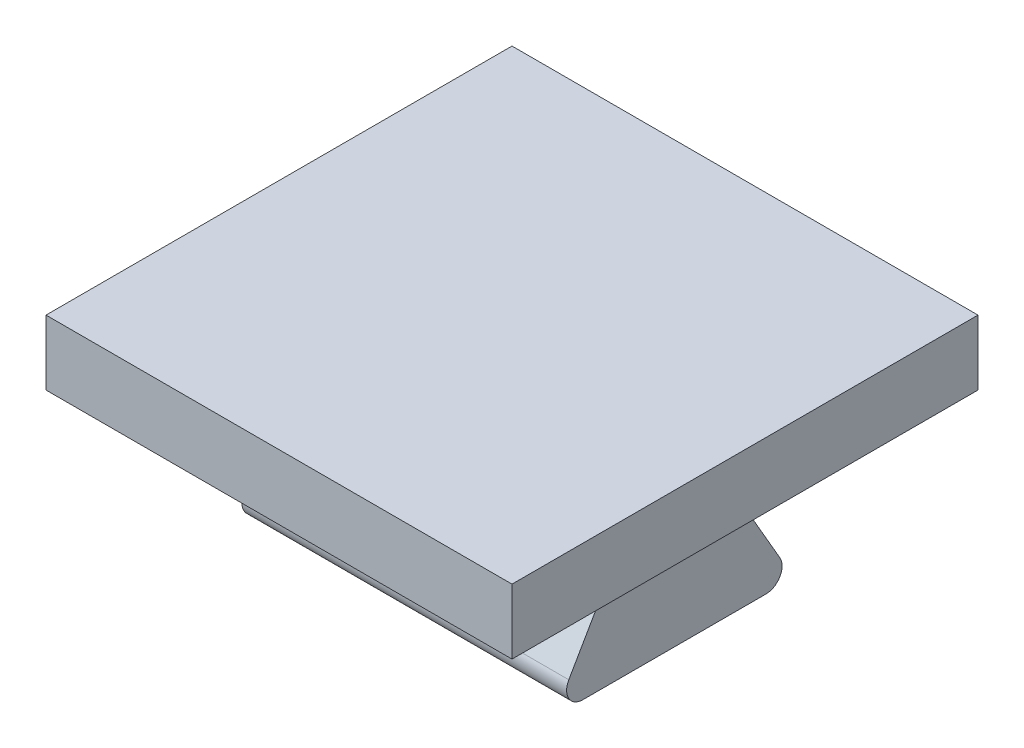
ISO-10303-21;
HEADER;
FILE_DESCRIPTION(('STEP AP214'),'2;1');
FILE_NAME('part.step','',(''),(''),'','','');
FILE_SCHEMA(('AUTOMOTIVE_DESIGN { 1 0 10303 214 1 1 1 1 }'));
ENDSEC;
DATA;
#1=APPLICATION_CONTEXT('core data for automotive mechanical design processes');
#2=APPLICATION_PROTOCOL_DEFINITION('international standard','automotive_design',2000,#1);
#3=PRODUCT_CONTEXT('',#1,'mechanical');
#4=PRODUCT('Part','Part','',(#3));
#5=PRODUCT_RELATED_PRODUCT_CATEGORY('part','',(#4));
#6=PRODUCT_DEFINITION_FORMATION('','',#4);
#7=PRODUCT_DEFINITION_CONTEXT('part definition',#1,'design');
#8=PRODUCT_DEFINITION('design','',#6,#7);
#9=PRODUCT_DEFINITION_SHAPE('','',#8);
#10=(LENGTH_UNIT() NAMED_UNIT(*) SI_UNIT(.MILLI.,.METRE.));
#11=(NAMED_UNIT(*) PLANE_ANGLE_UNIT() SI_UNIT($,.RADIAN.));
#12=(NAMED_UNIT(*) SI_UNIT($,.STERADIAN.) SOLID_ANGLE_UNIT());
#13=UNCERTAINTY_MEASURE_WITH_UNIT(LENGTH_MEASURE(1.E-05),#10,'distance_accuracy_value','');
#14=(GEOMETRIC_REPRESENTATION_CONTEXT(3) GLOBAL_UNCERTAINTY_ASSIGNED_CONTEXT((#13)) GLOBAL_UNIT_ASSIGNED_CONTEXT((#10,
#11,#12)) REPRESENTATION_CONTEXT('',''));
#15=CARTESIAN_POINT('',(0.,0.,0.));
#16=DIRECTION('',(0.,0.,1.));
#17=DIRECTION('',(1.,0.,0.));
#18=AXIS2_PLACEMENT_3D('',#15,#16,#17);
#19=CARTESIAN_POINT('',(7.175,3.,7.175));
#20=DIRECTION('',(-1.,0.,0.));
#21=DIRECTION('',(0.,0.,1.));
#22=AXIS2_PLACEMENT_3D('',#19,#20,#21);
#23=PLANE('',#22);
#24=DIRECTION('',(0.,-1.,0.));
#25=VECTOR('',#24,1.);
#26=CARTESIAN_POINT('',(7.175,3.,7.175));
#27=LINE('',#26,#25);
#28=CARTESIAN_POINT('',(7.175,3.,7.175));
#29=VERTEX_POINT('',#28);
#30=CARTESIAN_POINT('',(7.175,1.,7.175));
#31=VERTEX_POINT('',#30);
#32=EDGE_CURVE('E227',#29,#31,#27,.T.);
#33=ORIENTED_EDGE('',*,*,#32,.T.);
#34=DIRECTION('',(0.,0.,1.));
#35=VECTOR('',#34,1.);
#36=CARTESIAN_POINT('',(7.175,1.,-7.175));
#37=LINE('',#36,#35);
#38=CARTESIAN_POINT('',(7.175,1.,-7.175));
#39=VERTEX_POINT('',#38);
#40=EDGE_CURVE('E191',#39,#31,#37,.T.);
#41=ORIENTED_EDGE('',*,*,#40,.F.);
#42=DIRECTION('',(0.,-1.,0.));
#43=VECTOR('',#42,1.);
#44=CARTESIAN_POINT('',(7.175,3.,-7.175));
#45=LINE('',#44,#43);
#46=CARTESIAN_POINT('',(7.175,3.,-7.175));
#47=VERTEX_POINT('',#46);
#48=EDGE_CURVE('E236',#47,#39,#45,.T.);
#49=ORIENTED_EDGE('',*,*,#48,.F.);
#50=DIRECTION('',(0.,0.,-1.));
#51=VECTOR('',#50,1.);
#52=CARTESIAN_POINT('',(7.175,3.,7.175));
#53=LINE('',#52,#51);
#54=EDGE_CURVE('E212',#29,#47,#53,.T.);
#55=ORIENTED_EDGE('',*,*,#54,.F.);
#56=EDGE_LOOP('',(#33,#41,#49,#55));
#57=FACE_BOUND('',#56,.T.);
#58=ADVANCED_FACE('F34',(#57),#23,.F.);
#59=CARTESIAN_POINT('',(-7.175,3.,-7.175));
#60=DIRECTION('',(0.,0.,1.));
#61=DIRECTION('',(1.,0.,0.));
#62=AXIS2_PLACEMENT_3D('',#59,#60,#61);
#63=PLANE('',#62);
#64=ORIENTED_EDGE('',*,*,#48,.T.);
#65=DIRECTION('',(1.,0.,0.));
#66=VECTOR('',#65,1.);
#67=CARTESIAN_POINT('',(-7.175,1.,-7.175));
#68=LINE('',#67,#66);
#69=CARTESIAN_POINT('',(-7.175,1.,-7.175));
#70=VERTEX_POINT('',#69);
#71=EDGE_CURVE('E201',#70,#39,#68,.T.);
#72=ORIENTED_EDGE('',*,*,#71,.F.);
#73=DIRECTION('',(0.,-1.,0.));
#74=VECTOR('',#73,1.);
#75=CARTESIAN_POINT('',(-7.175,3.,-7.175));
#76=LINE('',#75,#74);
#77=CARTESIAN_POINT('',(-7.175,3.,-7.175));
#78=VERTEX_POINT('',#77);
#79=EDGE_CURVE('E233',#78,#70,#76,.T.);
#80=ORIENTED_EDGE('',*,*,#79,.F.);
#81=DIRECTION('',(-1.,0.,0.));
#82=VECTOR('',#81,1.);
#83=CARTESIAN_POINT('',(-7.175,3.,-7.175));
#84=LINE('',#83,#82);
#85=EDGE_CURVE('E221',#47,#78,#84,.T.);
#86=ORIENTED_EDGE('',*,*,#85,.F.);
#87=EDGE_LOOP('',(#64,#72,#80,#86));
#88=FACE_BOUND('',#87,.T.);
#89=ADVANCED_FACE('F311',(#88),#63,.F.);
#90=CARTESIAN_POINT('',(-7.175,3.,7.175));
#91=DIRECTION('',(1.,0.,0.));
#92=DIRECTION('',(0.,0.,-1.));
#93=AXIS2_PLACEMENT_3D('',#90,#91,#92);
#94=PLANE('',#93);
#95=ORIENTED_EDGE('',*,*,#79,.T.);
#96=DIRECTION('',(0.,0.,-1.));
#97=VECTOR('',#96,1.);
#98=CARTESIAN_POINT('',(-7.175,1.,-7.175));
#99=LINE('',#98,#97);
#100=CARTESIAN_POINT('',(-7.175,1.,7.175));
#101=VERTEX_POINT('',#100);
#102=EDGE_CURVE('E199',#101,#70,#99,.T.);
#103=ORIENTED_EDGE('',*,*,#102,.F.);
#104=DIRECTION('',(0.,-1.,0.));
#105=VECTOR('',#104,1.);
#106=CARTESIAN_POINT('',(-7.175,3.,7.175));
#107=LINE('',#106,#105);
#108=CARTESIAN_POINT('',(-7.175,3.,7.175));
#109=VERTEX_POINT('',#108);
#110=EDGE_CURVE('E230',#109,#101,#107,.T.);
#111=ORIENTED_EDGE('',*,*,#110,.F.);
#112=DIRECTION('',(0.,0.,1.));
#113=VECTOR('',#112,1.);
#114=CARTESIAN_POINT('',(-7.175,3.,7.175));
#115=LINE('',#114,#113);
#116=EDGE_CURVE('E223',#78,#109,#115,.T.);
#117=ORIENTED_EDGE('',*,*,#116,.F.);
#118=EDGE_LOOP('',(#95,#103,#111,#117));
#119=FACE_BOUND('',#118,.T.);
#120=ADVANCED_FACE('F317',(#119),#94,.F.);
#121=CARTESIAN_POINT('',(-7.175,3.,7.175));
#122=DIRECTION('',(0.,0.,-1.));
#123=DIRECTION('',(-1.,0.,0.));
#124=AXIS2_PLACEMENT_3D('',#121,#122,#123);
#125=PLANE('',#124);
#126=ORIENTED_EDGE('',*,*,#110,.T.);
#127=DIRECTION('',(-1.,0.,0.));
#128=VECTOR('',#127,1.);
#129=CARTESIAN_POINT('',(-7.175,1.,7.175));
#130=LINE('',#129,#128);
#131=EDGE_CURVE('E197',#31,#101,#130,.T.);
#132=ORIENTED_EDGE('',*,*,#131,.F.);
#133=ORIENTED_EDGE('',*,*,#32,.F.);
#134=DIRECTION('',(1.,0.,0.));
#135=VECTOR('',#134,1.);
#136=CARTESIAN_POINT('',(-7.175,3.,7.175));
#137=LINE('',#136,#135);
#138=EDGE_CURVE('E225',#109,#29,#137,.T.);
#139=ORIENTED_EDGE('',*,*,#138,.F.);
#140=EDGE_LOOP('',(#126,#132,#133,#139));
#141=FACE_BOUND('',#140,.T.);
#142=ADVANCED_FACE('F437',(#141),#125,.F.);
#143=CARTESIAN_POINT('',(0.,3.,0.));
#144=DIRECTION('',(0.,-1.,0.));
#145=DIRECTION('',(0.,0.,-1.));
#146=AXIS2_PLACEMENT_3D('',#143,#144,#145);
#147=PLANE('',#146);
#148=ORIENTED_EDGE('',*,*,#54,.T.);
#149=ORIENTED_EDGE('',*,*,#85,.T.);
#150=ORIENTED_EDGE('',*,*,#116,.T.);
#151=ORIENTED_EDGE('',*,*,#138,.T.);
#152=EDGE_LOOP('',(#148,#149,#150,#151));
#153=FACE_BOUND('',#152,.T.);
#154=ADVANCED_FACE('F393',(#153),#147,.F.);
#155=CARTESIAN_POINT('',(0.,1.,0.));
#156=DIRECTION('',(0.,1.,0.));
#157=DIRECTION('',(0.,0.,1.));
#158=AXIS2_PLACEMENT_3D('',#155,#156,#157);
#159=PLANE('',#158);
#160=DIRECTION('',(0.,0.,1.));
#161=VECTOR('',#160,1.);
#162=CARTESIAN_POINT('',(5.,1.,-3.68412340178524));
#163=LINE('',#162,#161);
#164=CARTESIAN_POINT('',(5.,1.,-3.68412340178524));
#165=VERTEX_POINT('',#164);
#166=CARTESIAN_POINT('',(5.,1.,3.68412340178524));
#167=VERTEX_POINT('',#166);
#168=EDGE_CURVE('E165',#165,#167,#163,.T.);
#169=ORIENTED_EDGE('',*,*,#168,.F.);
#170=DIRECTION('',(1.,0.,0.));
#171=VECTOR('',#170,1.);
#172=CARTESIAN_POINT('',(-5.,1.,-3.68412340178524));
#173=LINE('',#172,#171);
#174=CARTESIAN_POINT('',(-5.,1.,-3.68412340178524));
#175=VERTEX_POINT('',#174);
#176=EDGE_CURVE('E158',#175,#165,#173,.T.);
#177=ORIENTED_EDGE('',*,*,#176,.F.);
#178=DIRECTION('',(0.,0.,-1.));
#179=VECTOR('',#178,1.);
#180=CARTESIAN_POINT('',(-5.,1.,-3.68412340178524));
#181=LINE('',#180,#179);
#182=CARTESIAN_POINT('',(-5.,1.,3.68412340178524));
#183=VERTEX_POINT('',#182);
#184=EDGE_CURVE('E168',#183,#175,#181,.T.);
#185=ORIENTED_EDGE('',*,*,#184,.F.);
#186=DIRECTION('',(-1.,0.,0.));
#187=VECTOR('',#186,1.);
#188=CARTESIAN_POINT('',(-5.,1.,3.68412340178524));
#189=LINE('',#188,#187);
#190=EDGE_CURVE('E152',#167,#183,#189,.T.);
#191=ORIENTED_EDGE('',*,*,#190,.F.);
#192=EDGE_LOOP('',(#169,#177,#185,#191));
#193=FACE_BOUND('',#192,.T.);
#194=ORIENTED_EDGE('',*,*,#40,.T.);
#195=ORIENTED_EDGE('',*,*,#131,.T.);
#196=ORIENTED_EDGE('',*,*,#102,.T.);
#197=ORIENTED_EDGE('',*,*,#71,.T.);
#198=EDGE_LOOP('',(#194,#195,#196,#197));
#199=FACE_BOUND('',#198,.T.);
#200=ADVANCED_FACE('F162',(#193,#199),#159,.F.);
#201=CARTESIAN_POINT('',(-5.,1.,-3.68412340178524));
#202=DIRECTION('',(0.,0.,-1.));
#203=DIRECTION('',(-1.,0.,0.));
#204=AXIS2_PLACEMENT_3D('',#201,#202,#203);
#205=PLANE('',#204);
#206=DIRECTION('',(1.,0.,0.));
#207=VECTOR('',#206,1.);
#208=CARTESIAN_POINT('',(-5.,0.,-3.68412340178524));
#209=LINE('',#208,#207);
#210=CARTESIAN_POINT('',(-5.,0.,-3.68412340178524));
#211=VERTEX_POINT('',#210);
#212=CARTESIAN_POINT('',(5.,0.,-3.68412340178524));
#213=VERTEX_POINT('',#212);
#214=EDGE_CURVE('E174',#211,#213,#209,.T.);
#215=ORIENTED_EDGE('',*,*,#214,.F.);
#216=DIRECTION('',(0.,-1.,0.));
#217=VECTOR('',#216,1.);
#218=CARTESIAN_POINT('',(-5.,1.,-3.68412340178524));
#219=LINE('',#218,#217);
#220=EDGE_CURVE('E192',#175,#211,#219,.T.);
#221=ORIENTED_EDGE('',*,*,#220,.F.);
#222=ORIENTED_EDGE('',*,*,#176,.T.);
#223=DIRECTION('',(0.,-1.,0.));
#224=VECTOR('',#223,1.);
#225=CARTESIAN_POINT('',(5.,1.,-3.68412340178524));
#226=LINE('',#225,#224);
#227=EDGE_CURVE('E173',#165,#213,#226,.T.);
#228=ORIENTED_EDGE('',*,*,#227,.T.);
#229=EDGE_LOOP('',(#215,#221,#222,#228));
#230=FACE_BOUND('',#229,.T.);
#231=ADVANCED_FACE('F286',(#230),#205,.T.);
#232=CARTESIAN_POINT('',(-5.,1.,3.68412340178524));
#233=DIRECTION('',(0.,0.,1.));
#234=DIRECTION('',(1.,0.,0.));
#235=AXIS2_PLACEMENT_3D('',#232,#233,#234);
#236=PLANE('',#235);
#237=DIRECTION('',(-1.,0.,0.));
#238=VECTOR('',#237,1.);
#239=CARTESIAN_POINT('',(-5.,0.,3.68412340178524));
#240=LINE('',#239,#238);
#241=CARTESIAN_POINT('',(5.,0.,3.68412340178524));
#242=VERTEX_POINT('',#241);
#243=CARTESIAN_POINT('',(-5.,0.,3.68412340178524));
#244=VERTEX_POINT('',#243);
#245=EDGE_CURVE('E154',#242,#244,#240,.T.);
#246=ORIENTED_EDGE('',*,*,#245,.F.);
#247=DIRECTION('',(0.,-1.,0.));
#248=VECTOR('',#247,1.);
#249=CARTESIAN_POINT('',(5.,1.,3.68412340178524));
#250=LINE('',#249,#248);
#251=EDGE_CURVE('E149',#167,#242,#250,.T.);
#252=ORIENTED_EDGE('',*,*,#251,.F.);
#253=ORIENTED_EDGE('',*,*,#190,.T.);
#254=DIRECTION('',(0.,-1.,0.));
#255=VECTOR('',#254,1.);
#256=CARTESIAN_POINT('',(-5.,1.,3.68412340178524));
#257=LINE('',#256,#255);
#258=EDGE_CURVE('E157',#183,#244,#257,.T.);
#259=ORIENTED_EDGE('',*,*,#258,.T.);
#260=EDGE_LOOP('',(#246,#252,#253,#259));
#261=FACE_BOUND('',#260,.T.);
#262=ADVANCED_FACE('F151',(#261),#236,.T.);
#263=CARTESIAN_POINT('',(0.,0.,0.));
#264=DIRECTION('',(0.,-1.,0.));
#265=DIRECTION('',(0.,0.,-1.));
#266=AXIS2_PLACEMENT_3D('',#263,#264,#265);
#267=PLANE('',#266);
#268=DIRECTION('',(0.,0.,-1.));
#269=VECTOR('',#268,1.);
#270=CARTESIAN_POINT('',(-5.,0.,-3.68412340178524));
#271=LINE('',#270,#269);
#272=CARTESIAN_POINT('',(-5.,0.,2.61602540378444));
#273=VERTEX_POINT('',#272);
#274=EDGE_CURVE('E177',#244,#273,#271,.T.);
#275=ORIENTED_EDGE('',*,*,#274,.T.);
#276=DIRECTION('',(-1.,0.,0.));
#277=VECTOR('',#276,1.);
#278=CARTESIAN_POINT('',(0.,0.,2.61602540378444));
#279=LINE('',#278,#277);
#280=CARTESIAN_POINT('',(5.,0.,2.61602540378444));
#281=VERTEX_POINT('',#280);
#282=EDGE_CURVE('E244',#273,#281,#279,.F.);
#283=ORIENTED_EDGE('',*,*,#282,.T.);
#284=DIRECTION('',(0.,0.,1.));
#285=VECTOR('',#284,1.);
#286=CARTESIAN_POINT('',(5.,0.,-3.68412340178524));
#287=LINE('',#286,#285);
#288=EDGE_CURVE('E185',#281,#242,#287,.T.);
#289=ORIENTED_EDGE('',*,*,#288,.T.);
#290=ORIENTED_EDGE('',*,*,#245,.T.);
#291=EDGE_LOOP('',(#275,#283,#289,#290));
#292=FACE_BOUND('',#291,.T.);
#293=ADVANCED_FACE('F291',(#292),#267,.T.);
#294=CARTESIAN_POINT('',(5.,0.,1.75));
#295=DIRECTION('',(0.,-0.499999999999998,-0.86602540378444));
#296=DIRECTION('',(0.,0.86602540378444,-0.499999999999998));
#297=AXIS2_PLACEMENT_3D('',#294,#295,#296);
#298=PLANE('',#297);
#299=DIRECTION('',(0.,-0.86602540378444,0.499999999999998));
#300=VECTOR('',#299,1.);
#301=CARTESIAN_POINT('',(5.,0.,1.75));
#302=LINE('',#301,#300);
#303=CARTESIAN_POINT('',(5.,-0.749999999999999,2.18301270189222));
#304=VERTEX_POINT('',#303);
#305=CARTESIAN_POINT('',(5.,-2.6,3.25111069989302));
#306=VERTEX_POINT('',#305);
#307=EDGE_CURVE('E207',#304,#306,#302,.T.);
#308=ORIENTED_EDGE('',*,*,#307,.F.);
#309=DIRECTION('',(-1.,0.,0.));
#310=VECTOR('',#309,1.);
#311=CARTESIAN_POINT('',(5.,-0.749999999999999,2.18301270189222));
#312=LINE('',#311,#310);
#313=CARTESIAN_POINT('',(-5.,-0.749999999999999,2.18301270189222));
#314=VERTEX_POINT('',#313);
#315=EDGE_CURVE('E241',#304,#314,#312,.T.);
#316=ORIENTED_EDGE('',*,*,#315,.T.);
#317=DIRECTION('',(0.,-0.86602540378444,0.499999999999998));
#318=VECTOR('',#317,1.);
#319=CARTESIAN_POINT('',(-5.,0.,1.75));
#320=LINE('',#319,#318);
#321=CARTESIAN_POINT('',(-5.,-2.6,3.25111069989302));
#322=VERTEX_POINT('',#321);
#323=EDGE_CURVE('E215',#314,#322,#320,.T.);
#324=ORIENTED_EDGE('',*,*,#323,.T.);
#325=DIRECTION('',(-1.,0.,0.));
#326=VECTOR('',#325,1.);
#327=CARTESIAN_POINT('',(5.,-2.6,3.25111069989302));
#328=LINE('',#327,#326);
#329=EDGE_CURVE('E239',#322,#306,#328,.F.);
#330=ORIENTED_EDGE('',*,*,#329,.T.);
#331=EDGE_LOOP('',(#308,#316,#324,#330));
#332=FACE_BOUND('',#331,.T.);
#333=ADVANCED_FACE('F298',(#332),#298,.F.);
#334=CARTESIAN_POINT('',(5.,-3.35,-3.68412340178524));
#335=DIRECTION('',(0.,1.,0.));
#336=DIRECTION('',(0.,0.,1.));
#337=AXIS2_PLACEMENT_3D('',#334,#335,#336);
#338=PLANE('',#337);
#339=DIRECTION('',(0.,0.,-1.));
#340=VECTOR('',#339,1.);
#341=CARTESIAN_POINT('',(5.,-3.35,-3.68412340178524));
#342=LINE('',#341,#340);
#343=CARTESIAN_POINT('',(5.,-3.35,2.8180979980008));
#344=VERTEX_POINT('',#343);
#345=CARTESIAN_POINT('',(5.,-3.35,-2.8180979980008));
#346=VERTEX_POINT('',#345);
#347=EDGE_CURVE('E210',#344,#346,#342,.T.);
#348=ORIENTED_EDGE('',*,*,#347,.F.);
#349=DIRECTION('',(-1.,0.,0.));
#350=VECTOR('',#349,1.);
#351=CARTESIAN_POINT('',(5.,-3.35,2.8180979980008));
#352=LINE('',#351,#350);
#353=CARTESIAN_POINT('',(-5.,-3.35,2.8180979980008));
#354=VERTEX_POINT('',#353);
#355=EDGE_CURVE('E255',#344,#354,#352,.T.);
#356=ORIENTED_EDGE('',*,*,#355,.T.);
#357=DIRECTION('',(0.,0.,-1.));
#358=VECTOR('',#357,1.);
#359=CARTESIAN_POINT('',(-5.,-3.35,-3.68412340178524));
#360=LINE('',#359,#358);
#361=CARTESIAN_POINT('',(-5.,-3.35,-2.8180979980008));
#362=VERTEX_POINT('',#361);
#363=EDGE_CURVE('E208',#354,#362,#360,.T.);
#364=ORIENTED_EDGE('',*,*,#363,.T.);
#365=DIRECTION('',(-1.,0.,0.));
#366=VECTOR('',#365,1.);
#367=CARTESIAN_POINT('',(5.,-3.35,-2.8180979980008));
#368=LINE('',#367,#366);
#369=EDGE_CURVE('E49',#362,#346,#368,.F.);
#370=ORIENTED_EDGE('',*,*,#369,.T.);
#371=EDGE_LOOP('',(#348,#356,#364,#370));
#372=FACE_BOUND('',#371,.T.);
#373=ADVANCED_FACE('F303',(#372),#338,.F.);
#374=CARTESIAN_POINT('',(5.,0.,0.));
#375=DIRECTION('',(-1.,0.,0.));
#376=DIRECTION('',(0.,0.,1.));
#377=AXIS2_PLACEMENT_3D('',#374,#375,#376);
#378=PLANE('',#377);
#379=ORIENTED_EDGE('',*,*,#307,.T.);
#380=CARTESIAN_POINT('',(5.,-2.85,2.8180979980008));
#381=DIRECTION('',(-1.,0.,0.));
#382=DIRECTION('',(0.,0.,1.));
#383=AXIS2_PLACEMENT_3D('',#380,#381,#382);
#384=CIRCLE('',#383,0.5);
#385=EDGE_CURVE('E56',#306,#344,#384,.F.);
#386=ORIENTED_EDGE('',*,*,#385,.T.);
#387=ORIENTED_EDGE('',*,*,#347,.T.);
#388=CARTESIAN_POINT('',(5.,-2.85,-2.8180979980008));
#389=DIRECTION('',(-1.,0.,0.));
#390=DIRECTION('',(0.,0.,1.));
#391=AXIS2_PLACEMENT_3D('',#388,#389,#390);
#392=CIRCLE('',#391,0.5);
#393=CARTESIAN_POINT('',(5.,-2.6,-3.25111069989302));
#394=VERTEX_POINT('',#393);
#395=EDGE_CURVE('E262',#346,#394,#392,.F.);
#396=ORIENTED_EDGE('',*,*,#395,.T.);
#397=DIRECTION('',(0.,0.86602540378444,0.499999999999998));
#398=VECTOR('',#397,1.);
#399=CARTESIAN_POINT('',(5.,0.,-1.75));
#400=LINE('',#399,#398);
#401=CARTESIAN_POINT('',(5.,-0.749999999999999,-2.18301270189222));
#402=VERTEX_POINT('',#401);
#403=EDGE_CURVE('E204',#394,#402,#400,.T.);
#404=ORIENTED_EDGE('',*,*,#403,.T.);
#405=CARTESIAN_POINT('',(5.,-0.5,-2.61602540378444));
#406=DIRECTION('',(-1.,0.,0.));
#407=DIRECTION('',(0.,0.,1.));
#408=AXIS2_PLACEMENT_3D('',#405,#406,#407);
#409=CIRCLE('',#408,0.5);
#410=CARTESIAN_POINT('',(5.,0.,-2.61602540378444));
#411=VERTEX_POINT('',#410);
#412=EDGE_CURVE('E11',#402,#411,#409,.T.);
#413=ORIENTED_EDGE('',*,*,#412,.T.);
#414=EDGE_CURVE('E182',#213,#411,#287,.T.);
#415=ORIENTED_EDGE('',*,*,#414,.F.);
#416=ORIENTED_EDGE('',*,*,#227,.F.);
#417=ORIENTED_EDGE('',*,*,#168,.T.);
#418=ORIENTED_EDGE('',*,*,#251,.T.);
#419=ORIENTED_EDGE('',*,*,#288,.F.);
#420=CARTESIAN_POINT('',(5.,-0.5,2.61602540378444));
#421=DIRECTION('',(-1.,0.,0.));
#422=DIRECTION('',(0.,0.,1.));
#423=AXIS2_PLACEMENT_3D('',#420,#421,#422);
#424=CIRCLE('',#423,0.5);
#425=EDGE_CURVE('E267',#281,#304,#424,.T.);
#426=ORIENTED_EDGE('',*,*,#425,.T.);
#427=EDGE_LOOP('',(#379,#386,#387,#396,#404,#413,#415,#416,#417,#418,#419,#426));
#428=FACE_BOUND('',#427,.T.);
#429=ADVANCED_FACE('F171',(#428),#378,.F.);
#430=ORIENTED_EDGE('',*,*,#414,.T.);
#431=DIRECTION('',(-1.,0.,0.));
#432=VECTOR('',#431,1.);
#433=CARTESIAN_POINT('',(0.,0.,-2.61602540378444));
#434=LINE('',#433,#432);
#435=CARTESIAN_POINT('',(-5.,0.,-2.61602540378444));
#436=VERTEX_POINT('',#435);
#437=EDGE_CURVE('E246',#411,#436,#434,.T.);
#438=ORIENTED_EDGE('',*,*,#437,.T.);
#439=EDGE_CURVE('E187',#436,#211,#271,.T.);
#440=ORIENTED_EDGE('',*,*,#439,.T.);
#441=ORIENTED_EDGE('',*,*,#214,.T.);
#442=EDGE_LOOP('',(#430,#438,#440,#441));
#443=FACE_BOUND('',#442,.T.);
#444=ADVANCED_FACE('F283',(#443),#267,.T.);
#445=CARTESIAN_POINT('',(5.,0.,-1.75));
#446=DIRECTION('',(0.,-0.499999999999998,0.86602540378444));
#447=DIRECTION('',(0.,-0.86602540378444,-0.499999999999998));
#448=AXIS2_PLACEMENT_3D('',#445,#446,#447);
#449=PLANE('',#448);
#450=DIRECTION('',(0.,0.86602540378444,0.499999999999998));
#451=VECTOR('',#450,1.);
#452=CARTESIAN_POINT('',(-5.,0.,-1.75));
#453=LINE('',#452,#451);
#454=CARTESIAN_POINT('',(-5.,-2.6,-3.25111069989302));
#455=VERTEX_POINT('',#454);
#456=CARTESIAN_POINT('',(-5.,-0.749999999999999,-2.18301270189222));
#457=VERTEX_POINT('',#456);
#458=EDGE_CURVE('E203',#455,#457,#453,.T.);
#459=ORIENTED_EDGE('',*,*,#458,.T.);
#460=DIRECTION('',(-1.,0.,0.));
#461=VECTOR('',#460,1.);
#462=CARTESIAN_POINT('',(5.,-0.749999999999999,-2.18301270189222));
#463=LINE('',#462,#461);
#464=EDGE_CURVE('E252',#457,#402,#463,.F.);
#465=ORIENTED_EDGE('',*,*,#464,.T.);
#466=ORIENTED_EDGE('',*,*,#403,.F.);
#467=DIRECTION('',(-1.,0.,0.));
#468=VECTOR('',#467,1.);
#469=CARTESIAN_POINT('',(5.,-2.6,-3.25111069989302));
#470=LINE('',#469,#468);
#471=EDGE_CURVE('E249',#394,#455,#470,.T.);
#472=ORIENTED_EDGE('',*,*,#471,.T.);
#473=EDGE_LOOP('',(#459,#465,#466,#472));
#474=FACE_BOUND('',#473,.T.);
#475=ADVANCED_FACE('F277',(#474),#449,.F.);
#476=CARTESIAN_POINT('',(-5.,0.,0.));
#477=DIRECTION('',(-1.,0.,0.));
#478=DIRECTION('',(0.,0.,1.));
#479=AXIS2_PLACEMENT_3D('',#476,#477,#478);
#480=PLANE('',#479);
#481=ORIENTED_EDGE('',*,*,#363,.F.);
#482=CARTESIAN_POINT('',(-5.,-2.85,2.8180979980008));
#483=DIRECTION('',(-1.,0.,0.));
#484=DIRECTION('',(0.,0.,1.));
#485=AXIS2_PLACEMENT_3D('',#482,#483,#484);
#486=CIRCLE('',#485,0.5);
#487=EDGE_CURVE('E260',#354,#322,#486,.T.);
#488=ORIENTED_EDGE('',*,*,#487,.T.);
#489=ORIENTED_EDGE('',*,*,#323,.F.);
#490=CARTESIAN_POINT('',(-5.,-0.5,2.61602540378444));
#491=DIRECTION('',(-1.,0.,0.));
#492=DIRECTION('',(0.,0.,1.));
#493=AXIS2_PLACEMENT_3D('',#490,#491,#492);
#494=CIRCLE('',#493,0.5);
#495=EDGE_CURVE('E265',#314,#273,#494,.F.);
#496=ORIENTED_EDGE('',*,*,#495,.T.);
#497=ORIENTED_EDGE('',*,*,#274,.F.);
#498=ORIENTED_EDGE('',*,*,#258,.F.);
#499=ORIENTED_EDGE('',*,*,#184,.T.);
#500=ORIENTED_EDGE('',*,*,#220,.T.);
#501=ORIENTED_EDGE('',*,*,#439,.F.);
#502=CARTESIAN_POINT('',(-5.,-0.5,-2.61602540378444));
#503=DIRECTION('',(-1.,0.,0.));
#504=DIRECTION('',(0.,0.,1.));
#505=AXIS2_PLACEMENT_3D('',#502,#503,#504);
#506=CIRCLE('',#505,0.5);
#507=EDGE_CURVE('E42',#436,#457,#506,.F.);
#508=ORIENTED_EDGE('',*,*,#507,.T.);
#509=ORIENTED_EDGE('',*,*,#458,.F.);
#510=CARTESIAN_POINT('',(-5.,-2.85,-2.8180979980008));
#511=DIRECTION('',(-1.,0.,0.));
#512=DIRECTION('',(0.,0.,1.));
#513=AXIS2_PLACEMENT_3D('',#510,#511,#512);
#514=CIRCLE('',#513,0.5);
#515=EDGE_CURVE('E258',#455,#362,#514,.T.);
#516=ORIENTED_EDGE('',*,*,#515,.T.);
#517=EDGE_LOOP('',(#481,#488,#489,#496,#497,#498,#499,#500,#501,#508,#509,#516));
#518=FACE_BOUND('',#517,.T.);
#519=ADVANCED_FACE('F272',(#518),#480,.T.);
#520=CARTESIAN_POINT('',(5.,-0.5,2.61602540378444));
#521=DIRECTION('',(-1.,0.,0.));
#522=DIRECTION('',(0.,0.,1.));
#523=AXIS2_PLACEMENT_3D('',#520,#521,#522);
#524=CYLINDRICAL_SURFACE('',#523,0.5);
#525=ORIENTED_EDGE('',*,*,#425,.F.);
#526=ORIENTED_EDGE('',*,*,#282,.F.);
#527=ORIENTED_EDGE('',*,*,#495,.F.);
#528=ORIENTED_EDGE('',*,*,#315,.F.);
#529=EDGE_LOOP('',(#525,#526,#527,#528));
#530=FACE_BOUND('',#529,.T.);
#531=ADVANCED_FACE('F296',(#530),#524,.F.);
#532=CARTESIAN_POINT('',(0.,-0.5,-2.61602540378444));
#533=DIRECTION('',(-1.,0.,0.));
#534=DIRECTION('',(0.,0.,1.));
#535=AXIS2_PLACEMENT_3D('',#532,#533,#534);
#536=CYLINDRICAL_SURFACE('',#535,0.5);
#537=ORIENTED_EDGE('',*,*,#412,.F.);
#538=ORIENTED_EDGE('',*,*,#464,.F.);
#539=ORIENTED_EDGE('',*,*,#507,.F.);
#540=ORIENTED_EDGE('',*,*,#437,.F.);
#541=EDGE_LOOP('',(#537,#538,#539,#540));
#542=FACE_BOUND('',#541,.T.);
#543=ADVANCED_FACE('F281',(#542),#536,.F.);
#544=CARTESIAN_POINT('',(5.,-2.85,2.8180979980008));
#545=DIRECTION('',(-1.,0.,0.));
#546=DIRECTION('',(0.,0.,1.));
#547=AXIS2_PLACEMENT_3D('',#544,#545,#546);
#548=CYLINDRICAL_SURFACE('',#547,0.5);
#549=ORIENTED_EDGE('',*,*,#385,.F.);
#550=ORIENTED_EDGE('',*,*,#329,.F.);
#551=ORIENTED_EDGE('',*,*,#487,.F.);
#552=ORIENTED_EDGE('',*,*,#355,.F.);
#553=EDGE_LOOP('',(#549,#550,#551,#552));
#554=FACE_BOUND('',#553,.T.);
#555=ADVANCED_FACE('F302',(#554),#548,.T.);
#556=CARTESIAN_POINT('',(5.,-2.85,-2.8180979980008));
#557=DIRECTION('',(-1.,0.,0.));
#558=DIRECTION('',(0.,0.,1.));
#559=AXIS2_PLACEMENT_3D('',#556,#557,#558);
#560=CYLINDRICAL_SURFACE('',#559,0.5);
#561=ORIENTED_EDGE('',*,*,#395,.F.);
#562=ORIENTED_EDGE('',*,*,#369,.F.);
#563=ORIENTED_EDGE('',*,*,#515,.F.);
#564=ORIENTED_EDGE('',*,*,#471,.F.);
#565=EDGE_LOOP('',(#561,#562,#563,#564));
#566=FACE_BOUND('',#565,.T.);
#567=ADVANCED_FACE('F36',(#566),#560,.T.);
#568=CLOSED_SHELL('',(#58,#89,#120,#142,#154,#200,#231,#262,#293,#333,#373,#429,#444,#475,#519,
#531,#543,#555,#567));
#569=MANIFOLD_SOLID_BREP('B2',#568);
#570=ADVANCED_BREP_SHAPE_REPRESENTATION('',(#18,#569),#14);
#571=SHAPE_DEFINITION_REPRESENTATION(#9,#570);
ENDSEC;
END-ISO-10303-21;
